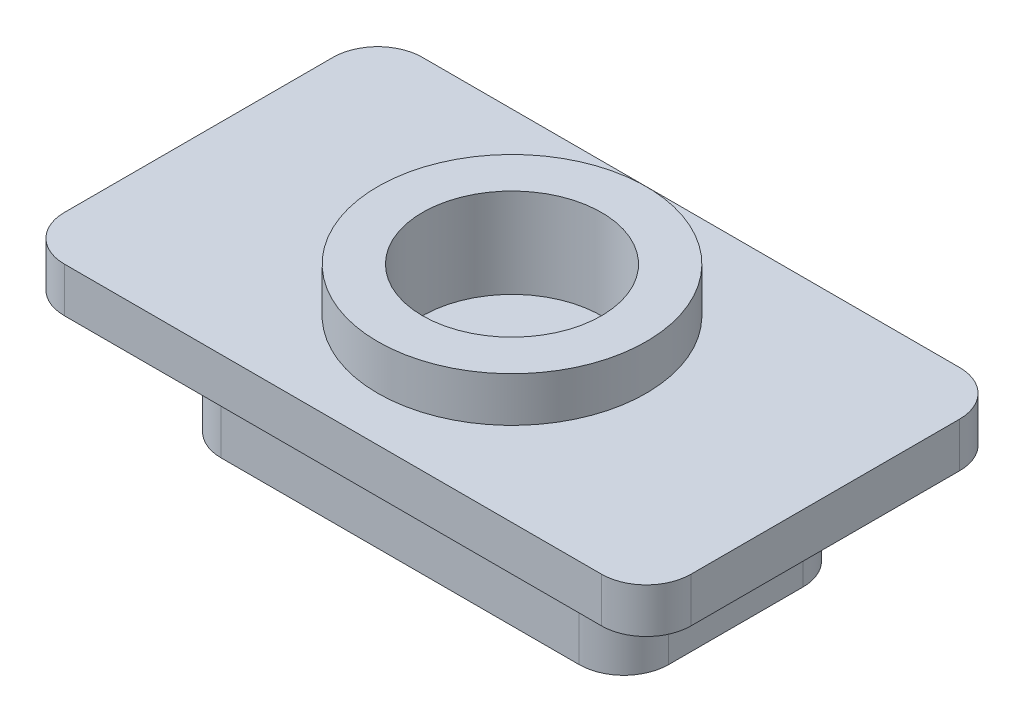
ISO-10303-21;
HEADER;
FILE_DESCRIPTION(('STEP AP214'),'2;1');
FILE_NAME('part.step','',(''),(''),'','','');
FILE_SCHEMA(('AUTOMOTIVE_DESIGN { 1 0 10303 214 1 1 1 1 }'));
ENDSEC;
DATA;
#1=APPLICATION_CONTEXT('core data for automotive mechanical design processes');
#2=APPLICATION_PROTOCOL_DEFINITION('international standard','automotive_design',2000,#1);
#3=PRODUCT_CONTEXT('',#1,'mechanical');
#4=PRODUCT('Part','Part','',(#3));
#5=PRODUCT_RELATED_PRODUCT_CATEGORY('part','',(#4));
#6=PRODUCT_DEFINITION_FORMATION('','',#4);
#7=PRODUCT_DEFINITION_CONTEXT('part definition',#1,'design');
#8=PRODUCT_DEFINITION('design','',#6,#7);
#9=PRODUCT_DEFINITION_SHAPE('','',#8);
#10=(LENGTH_UNIT() NAMED_UNIT(*) SI_UNIT(.MILLI.,.METRE.));
#11=(NAMED_UNIT(*) PLANE_ANGLE_UNIT() SI_UNIT($,.RADIAN.));
#12=(NAMED_UNIT(*) SI_UNIT($,.STERADIAN.) SOLID_ANGLE_UNIT());
#13=UNCERTAINTY_MEASURE_WITH_UNIT(LENGTH_MEASURE(1.E-05),#10,'distance_accuracy_value','');
#14=(GEOMETRIC_REPRESENTATION_CONTEXT(3) GLOBAL_UNCERTAINTY_ASSIGNED_CONTEXT((#13)) GLOBAL_UNIT_ASSIGNED_CONTEXT((#10,
#11,#12)) REPRESENTATION_CONTEXT('',''));
#15=CARTESIAN_POINT('',(0.,0.,0.));
#16=DIRECTION('',(0.,0.,1.));
#17=DIRECTION('',(1.,0.,0.));
#18=AXIS2_PLACEMENT_3D('',#15,#16,#17);
#19=CARTESIAN_POINT('',(3.99999999999999,2.5,1.5));
#20=DIRECTION('',(0.,-1.,0.));
#21=DIRECTION('',(0.,0.,-1.));
#22=AXIS2_PLACEMENT_3D('',#19,#20,#21);
#23=CYLINDRICAL_SURFACE('',#22,1.);
#24=CARTESIAN_POINT('',(3.99999999999999,0.,1.5));
#25=DIRECTION('',(0.,1.,0.));
#26=DIRECTION('',(0.,0.,1.));
#27=AXIS2_PLACEMENT_3D('',#24,#25,#26);
#28=CIRCLE('',#27,1.);
#29=CARTESIAN_POINT('',(3.99999999999999,0.,2.5));
#30=VERTEX_POINT('',#29);
#31=CARTESIAN_POINT('',(4.99999999999999,0.,1.5));
#32=VERTEX_POINT('',#31);
#33=EDGE_CURVE('E157',#30,#32,#28,.T.);
#34=ORIENTED_EDGE('',*,*,#33,.T.);
#35=DIRECTION('',(0.,-1.,0.));
#36=VECTOR('',#35,1.);
#37=CARTESIAN_POINT('',(4.99999999999999,2.5,1.5));
#38=LINE('',#37,#36);
#39=CARTESIAN_POINT('',(4.99999999999999,2.5,1.5));
#40=VERTEX_POINT('',#39);
#41=EDGE_CURVE('E42',#40,#32,#38,.T.);
#42=ORIENTED_EDGE('',*,*,#41,.F.);
#43=CARTESIAN_POINT('',(3.99999999999999,2.5,1.5));
#44=DIRECTION('',(0.,1.,0.));
#45=DIRECTION('',(0.,0.,1.));
#46=AXIS2_PLACEMENT_3D('',#43,#44,#45);
#47=CIRCLE('',#46,1.);
#48=CARTESIAN_POINT('',(3.99999999999999,2.5,2.5));
#49=VERTEX_POINT('',#48);
#50=EDGE_CURVE('E180',#49,#40,#47,.T.);
#51=ORIENTED_EDGE('',*,*,#50,.F.);
#52=DIRECTION('',(0.,-1.,0.));
#53=VECTOR('',#52,1.);
#54=CARTESIAN_POINT('',(3.99999999999999,2.5,2.5));
#55=LINE('',#54,#53);
#56=EDGE_CURVE('E156',#49,#30,#55,.T.);
#57=ORIENTED_EDGE('',*,*,#56,.T.);
#58=EDGE_LOOP('',(#34,#42,#51,#57));
#59=FACE_BOUND('',#58,.T.);
#60=ADVANCED_FACE('F39',(#59),#23,.T.);
#61=CARTESIAN_POINT('',(4.99999999999999,2.5,1.5));
#62=DIRECTION('',(-1.,0.,0.));
#63=DIRECTION('',(0.,0.,1.));
#64=AXIS2_PLACEMENT_3D('',#61,#62,#63);
#65=PLANE('',#64);
#66=DIRECTION('',(0.,0.,-1.));
#67=VECTOR('',#66,1.);
#68=CARTESIAN_POINT('',(4.99999999999999,0.,1.5));
#69=LINE('',#68,#67);
#70=CARTESIAN_POINT('',(5.,0.,-1.5));
#71=VERTEX_POINT('',#70);
#72=EDGE_CURVE('E161',#32,#71,#69,.T.);
#73=ORIENTED_EDGE('',*,*,#72,.T.);
#74=DIRECTION('',(0.,-1.,0.));
#75=VECTOR('',#74,1.);
#76=CARTESIAN_POINT('',(5.,2.5,-1.5));
#77=LINE('',#76,#75);
#78=CARTESIAN_POINT('',(5.,2.5,-1.5));
#79=VERTEX_POINT('',#78);
#80=EDGE_CURVE('E192',#79,#71,#77,.T.);
#81=ORIENTED_EDGE('',*,*,#80,.F.);
#82=DIRECTION('',(0.,0.,-1.));
#83=VECTOR('',#82,1.);
#84=CARTESIAN_POINT('',(4.99999999999999,2.5,1.5));
#85=LINE('',#84,#83);
#86=EDGE_CURVE('E100',#40,#79,#85,.T.);
#87=ORIENTED_EDGE('',*,*,#86,.F.);
#88=ORIENTED_EDGE('',*,*,#41,.T.);
#89=EDGE_LOOP('',(#73,#81,#87,#88));
#90=FACE_BOUND('',#89,.T.);
#91=ADVANCED_FACE('F199',(#90),#65,.F.);
#92=CARTESIAN_POINT('',(4.,2.5,-1.5));
#93=DIRECTION('',(0.,-1.,0.));
#94=DIRECTION('',(0.,0.,-1.));
#95=AXIS2_PLACEMENT_3D('',#92,#93,#94);
#96=CYLINDRICAL_SURFACE('',#95,1.);
#97=CARTESIAN_POINT('',(4.,0.,-1.5));
#98=DIRECTION('',(0.,1.,0.));
#99=DIRECTION('',(0.,0.,-1.));
#100=AXIS2_PLACEMENT_3D('',#97,#98,#99);
#101=CIRCLE('',#100,1.);
#102=CARTESIAN_POINT('',(4.,0.,-2.5));
#103=VERTEX_POINT('',#102);
#104=EDGE_CURVE('E165',#71,#103,#101,.T.);
#105=ORIENTED_EDGE('',*,*,#104,.T.);
#106=DIRECTION('',(0.,-1.,0.));
#107=VECTOR('',#106,1.);
#108=CARTESIAN_POINT('',(4.,2.5,-2.5));
#109=LINE('',#108,#107);
#110=CARTESIAN_POINT('',(4.,2.5,-2.5));
#111=VERTEX_POINT('',#110);
#112=EDGE_CURVE('E189',#111,#103,#109,.T.);
#113=ORIENTED_EDGE('',*,*,#112,.F.);
#114=CARTESIAN_POINT('',(4.,2.5,-1.5));
#115=DIRECTION('',(0.,1.,0.));
#116=DIRECTION('',(0.,0.,-1.));
#117=AXIS2_PLACEMENT_3D('',#114,#115,#116);
#118=CIRCLE('',#117,1.);
#119=EDGE_CURVE('E147',#79,#111,#118,.T.);
#120=ORIENTED_EDGE('',*,*,#119,.F.);
#121=ORIENTED_EDGE('',*,*,#80,.T.);
#122=EDGE_LOOP('',(#105,#113,#120,#121));
#123=FACE_BOUND('',#122,.T.);
#124=ADVANCED_FACE('F207',(#123),#96,.T.);
#125=CARTESIAN_POINT('',(-4.,2.5,-2.5));
#126=DIRECTION('',(0.,0.,1.));
#127=DIRECTION('',(1.,0.,0.));
#128=AXIS2_PLACEMENT_3D('',#125,#126,#127);
#129=PLANE('',#128);
#130=DIRECTION('',(-1.,0.,0.));
#131=VECTOR('',#130,1.);
#132=CARTESIAN_POINT('',(-4.,0.,-2.5));
#133=LINE('',#132,#131);
#134=CARTESIAN_POINT('',(-4.,0.,-2.5));
#135=VERTEX_POINT('',#134);
#136=EDGE_CURVE('E168',#103,#135,#133,.T.);
#137=ORIENTED_EDGE('',*,*,#136,.T.);
#138=DIRECTION('',(0.,-1.,0.));
#139=VECTOR('',#138,1.);
#140=CARTESIAN_POINT('',(-4.,2.5,-2.5));
#141=LINE('',#140,#139);
#142=CARTESIAN_POINT('',(-4.,2.5,-2.5));
#143=VERTEX_POINT('',#142);
#144=EDGE_CURVE('E127',#143,#135,#141,.T.);
#145=ORIENTED_EDGE('',*,*,#144,.F.);
#146=DIRECTION('',(-1.,0.,0.));
#147=VECTOR('',#146,1.);
#148=CARTESIAN_POINT('',(-4.,2.5,-2.5));
#149=LINE('',#148,#147);
#150=EDGE_CURVE('E143',#111,#143,#149,.T.);
#151=ORIENTED_EDGE('',*,*,#150,.F.);
#152=ORIENTED_EDGE('',*,*,#112,.T.);
#153=EDGE_LOOP('',(#137,#145,#151,#152));
#154=FACE_BOUND('',#153,.T.);
#155=ADVANCED_FACE('F209',(#154),#129,.F.);
#156=CARTESIAN_POINT('',(-4.,2.5,-1.5));
#157=DIRECTION('',(0.,-1.,0.));
#158=DIRECTION('',(0.,0.,-1.));
#159=AXIS2_PLACEMENT_3D('',#156,#157,#158);
#160=CYLINDRICAL_SURFACE('',#159,1.);
#161=CARTESIAN_POINT('',(-4.,0.,-1.5));
#162=DIRECTION('',(0.,1.,0.));
#163=DIRECTION('',(0.,0.,-1.));
#164=AXIS2_PLACEMENT_3D('',#161,#162,#163);
#165=CIRCLE('',#164,1.);
#166=CARTESIAN_POINT('',(-5.,0.,-1.5));
#167=VERTEX_POINT('',#166);
#168=EDGE_CURVE('E123',#135,#167,#165,.T.);
#169=ORIENTED_EDGE('',*,*,#168,.T.);
#170=DIRECTION('',(0.,-1.,0.));
#171=VECTOR('',#170,1.);
#172=CARTESIAN_POINT('',(-5.,2.5,-1.5));
#173=LINE('',#172,#171);
#174=CARTESIAN_POINT('',(-5.,2.5,-1.5));
#175=VERTEX_POINT('',#174);
#176=EDGE_CURVE('E115',#175,#167,#173,.T.);
#177=ORIENTED_EDGE('',*,*,#176,.F.);
#178=CARTESIAN_POINT('',(-4.,2.5,-1.5));
#179=DIRECTION('',(0.,1.,0.));
#180=DIRECTION('',(0.,0.,-1.));
#181=AXIS2_PLACEMENT_3D('',#178,#179,#180);
#182=CIRCLE('',#181,1.);
#183=EDGE_CURVE('E120',#143,#175,#182,.T.);
#184=ORIENTED_EDGE('',*,*,#183,.F.);
#185=ORIENTED_EDGE('',*,*,#144,.T.);
#186=EDGE_LOOP('',(#169,#177,#184,#185));
#187=FACE_BOUND('',#186,.T.);
#188=ADVANCED_FACE('F117',(#187),#160,.T.);
#189=CARTESIAN_POINT('',(-5.00000000000001,2.5,1.5));
#190=DIRECTION('',(1.,0.,0.));
#191=DIRECTION('',(0.,0.,-1.));
#192=AXIS2_PLACEMENT_3D('',#189,#190,#191);
#193=PLANE('',#192);
#194=DIRECTION('',(0.,0.,1.));
#195=VECTOR('',#194,1.);
#196=CARTESIAN_POINT('',(-5.00000000000001,0.,1.5));
#197=LINE('',#196,#195);
#198=CARTESIAN_POINT('',(-5.,0.,1.5));
#199=VERTEX_POINT('',#198);
#200=EDGE_CURVE('E173',#167,#199,#197,.T.);
#201=ORIENTED_EDGE('',*,*,#200,.T.);
#202=DIRECTION('',(0.,-1.,0.));
#203=VECTOR('',#202,1.);
#204=CARTESIAN_POINT('',(-5.,2.5,1.5));
#205=LINE('',#204,#203);
#206=CARTESIAN_POINT('',(-5.,2.5,1.5));
#207=VERTEX_POINT('',#206);
#208=EDGE_CURVE('E128',#207,#199,#205,.T.);
#209=ORIENTED_EDGE('',*,*,#208,.F.);
#210=DIRECTION('',(0.,0.,1.));
#211=VECTOR('',#210,1.);
#212=CARTESIAN_POINT('',(-5.00000000000001,2.5,1.5));
#213=LINE('',#212,#211);
#214=EDGE_CURVE('E131',#175,#207,#213,.T.);
#215=ORIENTED_EDGE('',*,*,#214,.F.);
#216=ORIENTED_EDGE('',*,*,#176,.T.);
#217=EDGE_LOOP('',(#201,#209,#215,#216));
#218=FACE_BOUND('',#217,.T.);
#219=ADVANCED_FACE('F132',(#218),#193,.F.);
#220=CARTESIAN_POINT('',(-4.,2.5,1.5));
#221=DIRECTION('',(0.,-1.,0.));
#222=DIRECTION('',(0.,0.,-1.));
#223=AXIS2_PLACEMENT_3D('',#220,#221,#222);
#224=CYLINDRICAL_SURFACE('',#223,1.);
#225=CARTESIAN_POINT('',(-4.,0.,1.5));
#226=DIRECTION('',(0.,1.,0.));
#227=DIRECTION('',(0.,0.,-1.));
#228=AXIS2_PLACEMENT_3D('',#225,#226,#227);
#229=CIRCLE('',#228,1.);
#230=CARTESIAN_POINT('',(-4.,0.,2.5));
#231=VERTEX_POINT('',#230);
#232=EDGE_CURVE('E85',#199,#231,#229,.T.);
#233=ORIENTED_EDGE('',*,*,#232,.T.);
#234=DIRECTION('',(0.,-1.,0.));
#235=VECTOR('',#234,1.);
#236=CARTESIAN_POINT('',(-4.,2.5,2.5));
#237=LINE('',#236,#235);
#238=CARTESIAN_POINT('',(-4.,2.5,2.5));
#239=VERTEX_POINT('',#238);
#240=EDGE_CURVE('E57',#239,#231,#237,.T.);
#241=ORIENTED_EDGE('',*,*,#240,.F.);
#242=CARTESIAN_POINT('',(-4.,2.5,1.5));
#243=DIRECTION('',(0.,1.,0.));
#244=DIRECTION('',(0.,0.,-1.));
#245=AXIS2_PLACEMENT_3D('',#242,#243,#244);
#246=CIRCLE('',#245,1.);
#247=EDGE_CURVE('E136',#207,#239,#246,.T.);
#248=ORIENTED_EDGE('',*,*,#247,.F.);
#249=ORIENTED_EDGE('',*,*,#208,.T.);
#250=EDGE_LOOP('',(#233,#241,#248,#249));
#251=FACE_BOUND('',#250,.T.);
#252=ADVANCED_FACE('F407',(#251),#224,.T.);
#253=CARTESIAN_POINT('',(-4.,2.5,2.5));
#254=DIRECTION('',(0.,0.,-1.));
#255=DIRECTION('',(-1.,0.,0.));
#256=AXIS2_PLACEMENT_3D('',#253,#254,#255);
#257=PLANE('',#256);
#258=DIRECTION('',(1.,0.,0.));
#259=VECTOR('',#258,1.);
#260=CARTESIAN_POINT('',(-4.,0.,2.5));
#261=LINE('',#260,#259);
#262=EDGE_CURVE('E91',#231,#30,#261,.T.);
#263=ORIENTED_EDGE('',*,*,#262,.T.);
#264=ORIENTED_EDGE('',*,*,#56,.F.);
#265=DIRECTION('',(1.,0.,0.));
#266=VECTOR('',#265,1.);
#267=CARTESIAN_POINT('',(-4.,2.5,2.5));
#268=LINE('',#267,#266);
#269=EDGE_CURVE('E153',#239,#49,#268,.T.);
#270=ORIENTED_EDGE('',*,*,#269,.F.);
#271=ORIENTED_EDGE('',*,*,#240,.T.);
#272=EDGE_LOOP('',(#263,#264,#270,#271));
#273=FACE_BOUND('',#272,.T.);
#274=ADVANCED_FACE('F410',(#273),#257,.F.);
#275=CARTESIAN_POINT('',(3.99999999999999,0.,1.5));
#276=DIRECTION('',(0.,1.,0.));
#277=DIRECTION('',(0.,0.,1.));
#278=AXIS2_PLACEMENT_3D('',#275,#276,#277);
#279=PLANE('',#278);
#280=ORIENTED_EDGE('',*,*,#33,.F.);
#281=ORIENTED_EDGE('',*,*,#262,.F.);
#282=ORIENTED_EDGE('',*,*,#232,.F.);
#283=ORIENTED_EDGE('',*,*,#200,.F.);
#284=ORIENTED_EDGE('',*,*,#168,.F.);
#285=ORIENTED_EDGE('',*,*,#136,.F.);
#286=ORIENTED_EDGE('',*,*,#104,.F.);
#287=ORIENTED_EDGE('',*,*,#72,.F.);
#288=EDGE_LOOP('',(#280,#281,#282,#283,#284,#285,#286,#287));
#289=FACE_BOUND('',#288,.T.);
#290=ADVANCED_FACE('F205',(#289),#279,.F.);
#291=CARTESIAN_POINT('',(-6.,3.5,-3.));
#292=DIRECTION('',(0.,-1.,0.));
#293=DIRECTION('',(0.,0.,-1.));
#294=AXIS2_PLACEMENT_3D('',#291,#292,#293);
#295=CYLINDRICAL_SURFACE('',#294,1.);
#296=CARTESIAN_POINT('',(-6.,2.5,-3.));
#297=DIRECTION('',(0.,1.,0.));
#298=DIRECTION('',(0.,0.,-1.));
#299=AXIS2_PLACEMENT_3D('',#296,#297,#298);
#300=CIRCLE('',#299,1.);
#301=CARTESIAN_POINT('',(-5.99999999999999,2.5,-4.));
#302=VERTEX_POINT('',#301);
#303=CARTESIAN_POINT('',(-7.,2.5,-2.99999999999999));
#304=VERTEX_POINT('',#303);
#305=EDGE_CURVE('E277',#302,#304,#300,.T.);
#306=ORIENTED_EDGE('',*,*,#305,.T.);
#307=DIRECTION('',(0.,-1.,0.));
#308=VECTOR('',#307,1.);
#309=CARTESIAN_POINT('',(-7.,3.5,-2.99999999999999));
#310=LINE('',#309,#308);
#311=CARTESIAN_POINT('',(-7.,3.5,-2.99999999999999));
#312=VERTEX_POINT('',#311);
#313=EDGE_CURVE('E162',#312,#304,#310,.T.);
#314=ORIENTED_EDGE('',*,*,#313,.F.);
#315=CARTESIAN_POINT('',(-6.,3.5,-3.));
#316=DIRECTION('',(0.,1.,0.));
#317=DIRECTION('',(0.,0.,-1.));
#318=AXIS2_PLACEMENT_3D('',#315,#316,#317);
#319=CIRCLE('',#318,1.);
#320=CARTESIAN_POINT('',(-5.99999999999999,3.5,-4.));
#321=VERTEX_POINT('',#320);
#322=EDGE_CURVE('E252',#321,#312,#319,.T.);
#323=ORIENTED_EDGE('',*,*,#322,.F.);
#324=DIRECTION('',(0.,-1.,0.));
#325=VECTOR('',#324,1.);
#326=CARTESIAN_POINT('',(-5.99999999999999,3.5,-4.));
#327=LINE('',#326,#325);
#328=EDGE_CURVE('E243',#321,#302,#327,.T.);
#329=ORIENTED_EDGE('',*,*,#328,.T.);
#330=EDGE_LOOP('',(#306,#314,#323,#329));
#331=FACE_BOUND('',#330,.T.);
#332=ADVANCED_FACE('F361',(#331),#295,.T.);
#333=CARTESIAN_POINT('',(-7.,3.5,2.99999999999999));
#334=DIRECTION('',(1.,0.,0.));
#335=DIRECTION('',(0.,0.,-1.));
#336=AXIS2_PLACEMENT_3D('',#333,#334,#335);
#337=PLANE('',#336);
#338=DIRECTION('',(0.,0.,1.));
#339=VECTOR('',#338,1.);
#340=CARTESIAN_POINT('',(-7.,2.5,2.99999999999999));
#341=LINE('',#340,#339);
#342=CARTESIAN_POINT('',(-7.,2.5,2.99999999999999));
#343=VERTEX_POINT('',#342);
#344=EDGE_CURVE('E273',#304,#343,#341,.T.);
#345=ORIENTED_EDGE('',*,*,#344,.T.);
#346=DIRECTION('',(0.,-1.,0.));
#347=VECTOR('',#346,1.);
#348=CARTESIAN_POINT('',(-7.,3.5,2.99999999999999));
#349=LINE('',#348,#347);
#350=CARTESIAN_POINT('',(-7.,3.5,2.99999999999999));
#351=VERTEX_POINT('',#350);
#352=EDGE_CURVE('E219',#351,#343,#349,.T.);
#353=ORIENTED_EDGE('',*,*,#352,.F.);
#354=DIRECTION('',(0.,0.,1.));
#355=VECTOR('',#354,1.);
#356=CARTESIAN_POINT('',(-7.,3.5,2.99999999999999));
#357=LINE('',#356,#355);
#358=EDGE_CURVE('E305',#312,#351,#357,.T.);
#359=ORIENTED_EDGE('',*,*,#358,.F.);
#360=ORIENTED_EDGE('',*,*,#313,.T.);
#361=EDGE_LOOP('',(#345,#353,#359,#360));
#362=FACE_BOUND('',#361,.T.);
#363=ADVANCED_FACE('F365',(#362),#337,.F.);
#364=CARTESIAN_POINT('',(-6.,3.5,3.));
#365=DIRECTION('',(0.,-1.,0.));
#366=DIRECTION('',(0.,0.,-1.));
#367=AXIS2_PLACEMENT_3D('',#364,#365,#366);
#368=CYLINDRICAL_SURFACE('',#367,1.);
#369=CARTESIAN_POINT('',(-6.,2.5,3.));
#370=DIRECTION('',(0.,1.,0.));
#371=DIRECTION('',(0.,0.,-1.));
#372=AXIS2_PLACEMENT_3D('',#369,#370,#371);
#373=CIRCLE('',#372,1.);
#374=CARTESIAN_POINT('',(-5.99999999999999,2.5,4.));
#375=VERTEX_POINT('',#374);
#376=EDGE_CURVE('E269',#343,#375,#373,.T.);
#377=ORIENTED_EDGE('',*,*,#376,.T.);
#378=DIRECTION('',(0.,-1.,0.));
#379=VECTOR('',#378,1.);
#380=CARTESIAN_POINT('',(-5.99999999999999,3.5,4.));
#381=LINE('',#380,#379);
#382=CARTESIAN_POINT('',(-5.99999999999999,3.5,4.));
#383=VERTEX_POINT('',#382);
#384=EDGE_CURVE('E223',#383,#375,#381,.T.);
#385=ORIENTED_EDGE('',*,*,#384,.F.);
#386=CARTESIAN_POINT('',(-6.,3.5,3.));
#387=DIRECTION('',(0.,1.,0.));
#388=DIRECTION('',(0.,0.,-1.));
#389=AXIS2_PLACEMENT_3D('',#386,#387,#388);
#390=CIRCLE('',#389,1.);
#391=EDGE_CURVE('E301',#351,#383,#390,.T.);
#392=ORIENTED_EDGE('',*,*,#391,.F.);
#393=ORIENTED_EDGE('',*,*,#352,.T.);
#394=EDGE_LOOP('',(#377,#385,#392,#393));
#395=FACE_BOUND('',#394,.T.);
#396=ADVANCED_FACE('F419',(#395),#368,.T.);
#397=CARTESIAN_POINT('',(-5.99999999999999,3.5,4.));
#398=DIRECTION('',(0.,0.,-1.));
#399=DIRECTION('',(-1.,0.,0.));
#400=AXIS2_PLACEMENT_3D('',#397,#398,#399);
#401=PLANE('',#400);
#402=DIRECTION('',(1.,0.,0.));
#403=VECTOR('',#402,1.);
#404=CARTESIAN_POINT('',(-5.99999999999999,2.5,4.));
#405=LINE('',#404,#403);
#406=CARTESIAN_POINT('',(5.99999999999999,2.5,4.));
#407=VERTEX_POINT('',#406);
#408=EDGE_CURVE('E265',#375,#407,#405,.T.);
#409=ORIENTED_EDGE('',*,*,#408,.T.);
#410=DIRECTION('',(0.,-1.,0.));
#411=VECTOR('',#410,1.);
#412=CARTESIAN_POINT('',(5.99999999999999,3.5,4.));
#413=LINE('',#412,#411);
#414=CARTESIAN_POINT('',(5.99999999999999,3.5,4.));
#415=VERTEX_POINT('',#414);
#416=EDGE_CURVE('E227',#415,#407,#413,.T.);
#417=ORIENTED_EDGE('',*,*,#416,.F.);
#418=DIRECTION('',(1.,0.,0.));
#419=VECTOR('',#418,1.);
#420=CARTESIAN_POINT('',(-5.99999999999999,3.5,4.));
#421=LINE('',#420,#419);
#422=EDGE_CURVE('E297',#383,#415,#421,.T.);
#423=ORIENTED_EDGE('',*,*,#422,.F.);
#424=ORIENTED_EDGE('',*,*,#384,.T.);
#425=EDGE_LOOP('',(#409,#417,#423,#424));
#426=FACE_BOUND('',#425,.T.);
#427=ADVANCED_FACE('F422',(#426),#401,.F.);
#428=CARTESIAN_POINT('',(6.,3.5,3.));
#429=DIRECTION('',(0.,-1.,0.));
#430=DIRECTION('',(0.,0.,-1.));
#431=AXIS2_PLACEMENT_3D('',#428,#429,#430);
#432=CYLINDRICAL_SURFACE('',#431,1.);
#433=CARTESIAN_POINT('',(6.,2.5,3.));
#434=DIRECTION('',(0.,1.,0.));
#435=DIRECTION('',(0.,0.,1.));
#436=AXIS2_PLACEMENT_3D('',#433,#434,#435);
#437=CIRCLE('',#436,1.);
#438=CARTESIAN_POINT('',(7.,2.5,2.99999999999999));
#439=VERTEX_POINT('',#438);
#440=EDGE_CURVE('E261',#407,#439,#437,.T.);
#441=ORIENTED_EDGE('',*,*,#440,.T.);
#442=DIRECTION('',(0.,-1.,0.));
#443=VECTOR('',#442,1.);
#444=CARTESIAN_POINT('',(7.,3.5,2.99999999999999));
#445=LINE('',#444,#443);
#446=CARTESIAN_POINT('',(7.,3.5,2.99999999999999));
#447=VERTEX_POINT('',#446);
#448=EDGE_CURVE('E231',#447,#439,#445,.T.);
#449=ORIENTED_EDGE('',*,*,#448,.F.);
#450=CARTESIAN_POINT('',(6.,3.5,3.));
#451=DIRECTION('',(0.,1.,0.));
#452=DIRECTION('',(0.,0.,1.));
#453=AXIS2_PLACEMENT_3D('',#450,#451,#452);
#454=CIRCLE('',#453,1.);
#455=EDGE_CURVE('E293',#415,#447,#454,.T.);
#456=ORIENTED_EDGE('',*,*,#455,.F.);
#457=ORIENTED_EDGE('',*,*,#416,.T.);
#458=EDGE_LOOP('',(#441,#449,#456,#457));
#459=FACE_BOUND('',#458,.T.);
#460=ADVANCED_FACE('F426',(#459),#432,.T.);
#461=CARTESIAN_POINT('',(7.,3.5,2.99999999999999));
#462=DIRECTION('',(-1.,0.,0.));
#463=DIRECTION('',(0.,0.,1.));
#464=AXIS2_PLACEMENT_3D('',#461,#462,#463);
#465=PLANE('',#464);
#466=DIRECTION('',(0.,0.,-1.));
#467=VECTOR('',#466,1.);
#468=CARTESIAN_POINT('',(7.,2.5,2.99999999999999));
#469=LINE('',#468,#467);
#470=CARTESIAN_POINT('',(7.,2.5,-2.99999999999999));
#471=VERTEX_POINT('',#470);
#472=EDGE_CURVE('E257',#439,#471,#469,.T.);
#473=ORIENTED_EDGE('',*,*,#472,.T.);
#474=DIRECTION('',(0.,-1.,0.));
#475=VECTOR('',#474,1.);
#476=CARTESIAN_POINT('',(7.,3.5,-2.99999999999999));
#477=LINE('',#476,#475);
#478=CARTESIAN_POINT('',(7.,3.5,-2.99999999999999));
#479=VERTEX_POINT('',#478);
#480=EDGE_CURVE('E235',#479,#471,#477,.T.);
#481=ORIENTED_EDGE('',*,*,#480,.F.);
#482=DIRECTION('',(0.,0.,-1.));
#483=VECTOR('',#482,1.);
#484=CARTESIAN_POINT('',(7.,3.5,2.99999999999999));
#485=LINE('',#484,#483);
#486=EDGE_CURVE('E289',#447,#479,#485,.T.);
#487=ORIENTED_EDGE('',*,*,#486,.F.);
#488=ORIENTED_EDGE('',*,*,#448,.T.);
#489=EDGE_LOOP('',(#473,#481,#487,#488));
#490=FACE_BOUND('',#489,.T.);
#491=ADVANCED_FACE('F430',(#490),#465,.F.);
#492=CARTESIAN_POINT('',(6.,3.5,-3.));
#493=DIRECTION('',(0.,-1.,0.));
#494=DIRECTION('',(0.,0.,-1.));
#495=AXIS2_PLACEMENT_3D('',#492,#493,#494);
#496=CYLINDRICAL_SURFACE('',#495,1.);
#497=CARTESIAN_POINT('',(6.,2.5,-3.));
#498=DIRECTION('',(0.,1.,0.));
#499=DIRECTION('',(0.,0.,-1.));
#500=AXIS2_PLACEMENT_3D('',#497,#498,#499);
#501=CIRCLE('',#500,1.);
#502=CARTESIAN_POINT('',(5.99999999999999,2.5,-4.));
#503=VERTEX_POINT('',#502);
#504=EDGE_CURVE('E253',#471,#503,#501,.T.);
#505=ORIENTED_EDGE('',*,*,#504,.T.);
#506=DIRECTION('',(0.,-1.,0.));
#507=VECTOR('',#506,1.);
#508=CARTESIAN_POINT('',(5.99999999999999,3.5,-4.));
#509=LINE('',#508,#507);
#510=CARTESIAN_POINT('',(5.99999999999999,3.5,-4.));
#511=VERTEX_POINT('',#510);
#512=EDGE_CURVE('E239',#511,#503,#509,.T.);
#513=ORIENTED_EDGE('',*,*,#512,.F.);
#514=CARTESIAN_POINT('',(6.,3.5,-3.));
#515=DIRECTION('',(0.,1.,0.));
#516=DIRECTION('',(0.,0.,-1.));
#517=AXIS2_PLACEMENT_3D('',#514,#515,#516);
#518=CIRCLE('',#517,1.);
#519=EDGE_CURVE('E285',#479,#511,#518,.T.);
#520=ORIENTED_EDGE('',*,*,#519,.F.);
#521=ORIENTED_EDGE('',*,*,#480,.T.);
#522=EDGE_LOOP('',(#505,#513,#520,#521));
#523=FACE_BOUND('',#522,.T.);
#524=ADVANCED_FACE('F434',(#523),#496,.T.);
#525=CARTESIAN_POINT('',(-5.99999999999999,3.5,-4.));
#526=DIRECTION('',(0.,0.,1.));
#527=DIRECTION('',(1.,0.,0.));
#528=AXIS2_PLACEMENT_3D('',#525,#526,#527);
#529=PLANE('',#528);
#530=DIRECTION('',(-1.,0.,0.));
#531=VECTOR('',#530,1.);
#532=CARTESIAN_POINT('',(-5.99999999999999,2.5,-4.));
#533=LINE('',#532,#531);
#534=EDGE_CURVE('E248',#503,#302,#533,.T.);
#535=ORIENTED_EDGE('',*,*,#534,.T.);
#536=ORIENTED_EDGE('',*,*,#328,.F.);
#537=DIRECTION('',(-1.,0.,0.));
#538=VECTOR('',#537,1.);
#539=CARTESIAN_POINT('',(-5.99999999999999,3.5,-4.));
#540=LINE('',#539,#538);
#541=EDGE_CURVE('E247',#511,#321,#540,.T.);
#542=ORIENTED_EDGE('',*,*,#541,.F.);
#543=ORIENTED_EDGE('',*,*,#512,.T.);
#544=EDGE_LOOP('',(#535,#536,#542,#543));
#545=FACE_BOUND('',#544,.T.);
#546=ADVANCED_FACE('F347',(#545),#529,.F.);
#547=CARTESIAN_POINT('',(-6.,3.5,-3.));
#548=DIRECTION('',(0.,-1.,0.));
#549=DIRECTION('',(0.,0.,-1.));
#550=AXIS2_PLACEMENT_3D('',#547,#548,#549);
#551=PLANE('',#550);
#552=CARTESIAN_POINT('',(0.,3.5,0.));
#553=DIRECTION('',(0.,1.,0.));
#554=DIRECTION('',(0.,0.,1.));
#555=AXIS2_PLACEMENT_3D('',#552,#553,#554);
#556=CIRCLE('',#555,3.);
#557=CARTESIAN_POINT('',(0.,3.5,3.));
#558=VERTEX_POINT('',#557);
#559=EDGE_CURVE('E11',#558,#558,#556,.T.);
#560=ORIENTED_EDGE('',*,*,#559,.F.);
#561=EDGE_LOOP('',(#560));
#562=FACE_BOUND('',#561,.T.);
#563=ORIENTED_EDGE('',*,*,#322,.T.);
#564=ORIENTED_EDGE('',*,*,#358,.T.);
#565=ORIENTED_EDGE('',*,*,#391,.T.);
#566=ORIENTED_EDGE('',*,*,#422,.T.);
#567=ORIENTED_EDGE('',*,*,#455,.T.);
#568=ORIENTED_EDGE('',*,*,#486,.T.);
#569=ORIENTED_EDGE('',*,*,#519,.T.);
#570=ORIENTED_EDGE('',*,*,#541,.T.);
#571=EDGE_LOOP('',(#563,#564,#565,#566,#567,#568,#569,#570));
#572=FACE_BOUND('',#571,.T.);
#573=ADVANCED_FACE('F344',(#562,#572),#551,.F.);
#574=CARTESIAN_POINT('',(-6.,2.5,-3.));
#575=DIRECTION('',(0.,-1.,0.));
#576=DIRECTION('',(0.,0.,-1.));
#577=AXIS2_PLACEMENT_3D('',#574,#575,#576);
#578=PLANE('',#577);
#579=ORIENTED_EDGE('',*,*,#269,.T.);
#580=ORIENTED_EDGE('',*,*,#50,.T.);
#581=ORIENTED_EDGE('',*,*,#86,.T.);
#582=ORIENTED_EDGE('',*,*,#119,.T.);
#583=ORIENTED_EDGE('',*,*,#150,.T.);
#584=ORIENTED_EDGE('',*,*,#183,.T.);
#585=ORIENTED_EDGE('',*,*,#214,.T.);
#586=ORIENTED_EDGE('',*,*,#247,.T.);
#587=EDGE_LOOP('',(#579,#580,#581,#582,#583,#584,#585,#586));
#588=FACE_BOUND('',#587,.T.);
#589=ORIENTED_EDGE('',*,*,#305,.F.);
#590=ORIENTED_EDGE('',*,*,#534,.F.);
#591=ORIENTED_EDGE('',*,*,#504,.F.);
#592=ORIENTED_EDGE('',*,*,#472,.F.);
#593=ORIENTED_EDGE('',*,*,#440,.F.);
#594=ORIENTED_EDGE('',*,*,#408,.F.);
#595=ORIENTED_EDGE('',*,*,#376,.F.);
#596=ORIENTED_EDGE('',*,*,#344,.F.);
#597=EDGE_LOOP('',(#589,#590,#591,#592,#593,#594,#595,#596));
#598=FACE_BOUND('',#597,.T.);
#599=ADVANCED_FACE('F139',(#588,#598),#578,.T.);
#600=CARTESIAN_POINT('',(0.,4.5,0.));
#601=DIRECTION('',(0.,-1.,0.));
#602=DIRECTION('',(0.,0.,-1.));
#603=AXIS2_PLACEMENT_3D('',#600,#601,#602);
#604=CYLINDRICAL_SURFACE('',#603,3.);
#605=CARTESIAN_POINT('',(0.,4.5,0.));
#606=DIRECTION('',(0.,1.,0.));
#607=DIRECTION('',(0.,0.,1.));
#608=AXIS2_PLACEMENT_3D('',#605,#606,#607);
#609=CIRCLE('',#608,3.);
#610=CARTESIAN_POINT('',(0.,4.5,3.));
#611=VERTEX_POINT('',#610);
#612=EDGE_CURVE('E281',#611,#611,#609,.T.);
#613=ORIENTED_EDGE('',*,*,#612,.F.);
#614=EDGE_LOOP('',(#613));
#615=FACE_BOUND('',#614,.T.);
#616=ORIENTED_EDGE('',*,*,#559,.T.);
#617=EDGE_LOOP('',(#616));
#618=FACE_BOUND('',#617,.T.);
#619=ADVANCED_FACE('F335',(#615,#618),#604,.T.);
#620=CARTESIAN_POINT('',(0.,4.5,0.));
#621=DIRECTION('',(0.,1.,0.));
#622=DIRECTION('',(0.,0.,1.));
#623=AXIS2_PLACEMENT_3D('',#620,#621,#622);
#624=PLANE('',#623);
#625=CARTESIAN_POINT('',(0.,4.5,0.));
#626=DIRECTION('',(0.,1.,0.));
#627=DIRECTION('',(0.,0.,1.));
#628=AXIS2_PLACEMENT_3D('',#625,#626,#627);
#629=CIRCLE('',#628,2.);
#630=CARTESIAN_POINT('',(0.,4.5,2.));
#631=VERTEX_POINT('',#630);
#632=EDGE_CURVE('E316',#631,#631,#629,.T.);
#633=ORIENTED_EDGE('',*,*,#632,.F.);
#634=EDGE_LOOP('',(#633));
#635=FACE_BOUND('',#634,.T.);
#636=ORIENTED_EDGE('',*,*,#612,.T.);
#637=EDGE_LOOP('',(#636));
#638=FACE_BOUND('',#637,.T.);
#639=ADVANCED_FACE('F329',(#635,#638),#624,.T.);
#640=CARTESIAN_POINT('',(0.,2.5,0.));
#641=DIRECTION('',(0.,1.,0.));
#642=DIRECTION('',(0.,0.,1.));
#643=AXIS2_PLACEMENT_3D('',#640,#641,#642);
#644=CYLINDRICAL_SURFACE('',#643,2.);
#645=CARTESIAN_POINT('',(0.,2.5,0.));
#646=DIRECTION('',(0.,1.,0.));
#647=DIRECTION('',(0.,0.,1.));
#648=AXIS2_PLACEMENT_3D('',#645,#646,#647);
#649=CIRCLE('',#648,2.);
#650=CARTESIAN_POINT('',(0.,2.5,2.));
#651=VERTEX_POINT('',#650);
#652=EDGE_CURVE('E315',#651,#651,#649,.T.);
#653=ORIENTED_EDGE('',*,*,#652,.F.);
#654=EDGE_LOOP('',(#653));
#655=FACE_BOUND('',#654,.T.);
#656=ORIENTED_EDGE('',*,*,#632,.T.);
#657=EDGE_LOOP('',(#656));
#658=FACE_BOUND('',#657,.T.);
#659=ADVANCED_FACE('F326',(#655,#658),#644,.F.);
#660=CARTESIAN_POINT('',(0.,2.5,0.));
#661=DIRECTION('',(0.,1.,0.));
#662=DIRECTION('',(0.,0.,1.));
#663=AXIS2_PLACEMENT_3D('',#660,#661,#662);
#664=PLANE('',#663);
#665=ORIENTED_EDGE('',*,*,#652,.T.);
#666=EDGE_LOOP('',(#665));
#667=FACE_BOUND('',#666,.T.);
#668=ADVANCED_FACE('F324',(#667),#664,.T.);
#669=CLOSED_SHELL('',(#60,#91,#124,#155,#188,#219,#252,#274,#290,#332,#363,#396,#427,#460,#491,
#524,#546,#573,#599,#619,#639,#659,#668));
#670=MANIFOLD_SOLID_BREP('B2',#669);
#671=ADVANCED_BREP_SHAPE_REPRESENTATION('',(#18,#670),#14);
#672=SHAPE_DEFINITION_REPRESENTATION(#9,#671);
ENDSEC;
END-ISO-10303-21;
